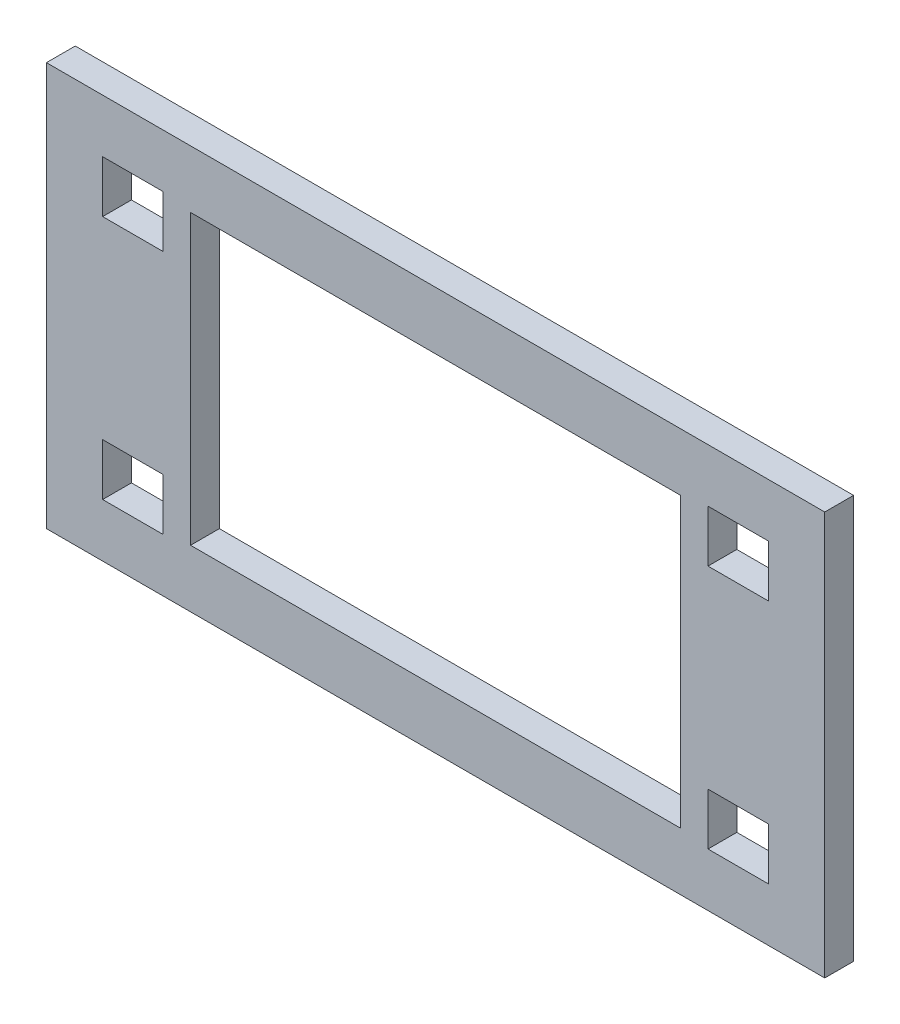
ISO-10303-21;
HEADER;
FILE_DESCRIPTION(('STEP AP214'),'2;1');
FILE_NAME('part.step','',(''),(''),'','','');
FILE_SCHEMA(('AUTOMOTIVE_DESIGN { 1 0 10303 214 1 1 1 1 }'));
ENDSEC;
DATA;
#1=APPLICATION_CONTEXT('core data for automotive mechanical design processes');
#2=APPLICATION_PROTOCOL_DEFINITION('international standard','automotive_design',2000,#1);
#3=PRODUCT_CONTEXT('',#1,'mechanical');
#4=PRODUCT('Part','Part','',(#3));
#5=PRODUCT_RELATED_PRODUCT_CATEGORY('part','',(#4));
#6=PRODUCT_DEFINITION_FORMATION('','',#4);
#7=PRODUCT_DEFINITION_CONTEXT('part definition',#1,'design');
#8=PRODUCT_DEFINITION('design','',#6,#7);
#9=PRODUCT_DEFINITION_SHAPE('','',#8);
#10=(LENGTH_UNIT() NAMED_UNIT(*) SI_UNIT(.MILLI.,.METRE.));
#11=(NAMED_UNIT(*) PLANE_ANGLE_UNIT() SI_UNIT($,.RADIAN.));
#12=(NAMED_UNIT(*) SI_UNIT($,.STERADIAN.) SOLID_ANGLE_UNIT());
#13=UNCERTAINTY_MEASURE_WITH_UNIT(LENGTH_MEASURE(1.E-05),#10,'distance_accuracy_value','');
#14=(GEOMETRIC_REPRESENTATION_CONTEXT(3) GLOBAL_UNCERTAINTY_ASSIGNED_CONTEXT((#13)) GLOBAL_UNIT_ASSIGNED_CONTEXT((#10,
#11,#12)) REPRESENTATION_CONTEXT('',''));
#15=CARTESIAN_POINT('',(0.,0.,0.));
#16=DIRECTION('',(0.,0.,1.));
#17=DIRECTION('',(1.,0.,0.));
#18=AXIS2_PLACEMENT_3D('',#15,#16,#17);
#19=CARTESIAN_POINT('',(0.,0.,2.));
#20=DIRECTION('',(0.,0.,1.));
#21=DIRECTION('',(1.,0.,0.));
#22=AXIS2_PLACEMENT_3D('',#19,#20,#21);
#23=PLANE('',#22);
#24=DIRECTION('',(0.,-1.,0.));
#25=VECTOR('',#24,1.);
#26=CARTESIAN_POINT('',(-27.,14.,2.));
#27=LINE('',#26,#25);
#28=CARTESIAN_POINT('',(-27.,14.,2.));
#29=VERTEX_POINT('',#28);
#30=CARTESIAN_POINT('',(-27.,-14.,2.));
#31=VERTEX_POINT('',#30);
#32=EDGE_CURVE('E286',#29,#31,#27,.T.);
#33=ORIENTED_EDGE('',*,*,#32,.T.);
#34=DIRECTION('',(1.,0.,0.));
#35=VECTOR('',#34,1.);
#36=CARTESIAN_POINT('',(-27.,-14.,2.));
#37=LINE('',#36,#35);
#38=CARTESIAN_POINT('',(27.,-14.,2.));
#39=VERTEX_POINT('',#38);
#40=EDGE_CURVE('E291',#31,#39,#37,.T.);
#41=ORIENTED_EDGE('',*,*,#40,.T.);
#42=DIRECTION('',(0.,1.,0.));
#43=VECTOR('',#42,1.);
#44=CARTESIAN_POINT('',(27.,-14.,2.));
#45=LINE('',#44,#43);
#46=CARTESIAN_POINT('',(27.,14.,2.));
#47=VERTEX_POINT('',#46);
#48=EDGE_CURVE('E298',#39,#47,#45,.T.);
#49=ORIENTED_EDGE('',*,*,#48,.T.);
#50=DIRECTION('',(-1.,0.,0.));
#51=VECTOR('',#50,1.);
#52=CARTESIAN_POINT('',(27.,14.,2.));
#53=LINE('',#52,#51);
#54=EDGE_CURVE('E297',#47,#29,#53,.T.);
#55=ORIENTED_EDGE('',*,*,#54,.T.);
#56=EDGE_LOOP('',(#33,#41,#49,#55));
#57=FACE_BOUND('',#56,.T.);
#58=DIRECTION('',(-1.,0.,0.));
#59=VECTOR('',#58,1.);
#60=CARTESIAN_POINT('',(0.,-10.,2.));
#61=LINE('',#60,#59);
#62=CARTESIAN_POINT('',(17.,-10.,2.));
#63=VERTEX_POINT('',#62);
#64=CARTESIAN_POINT('',(-17.,-10.,2.));
#65=VERTEX_POINT('',#64);
#66=EDGE_CURVE('E282',#63,#65,#61,.T.);
#67=ORIENTED_EDGE('',*,*,#66,.T.);
#68=DIRECTION('',(0.,1.,0.));
#69=VECTOR('',#68,1.);
#70=CARTESIAN_POINT('',(-17.,0.,2.));
#71=LINE('',#70,#69);
#72=CARTESIAN_POINT('',(-17.,10.,2.));
#73=VERTEX_POINT('',#72);
#74=EDGE_CURVE('E288',#65,#73,#71,.T.);
#75=ORIENTED_EDGE('',*,*,#74,.T.);
#76=DIRECTION('',(1.,0.,0.));
#77=VECTOR('',#76,1.);
#78=CARTESIAN_POINT('',(0.,10.,2.));
#79=LINE('',#78,#77);
#80=CARTESIAN_POINT('',(17.,10.,2.));
#81=VERTEX_POINT('',#80);
#82=EDGE_CURVE('E280',#73,#81,#79,.T.);
#83=ORIENTED_EDGE('',*,*,#82,.T.);
#84=DIRECTION('',(0.,-1.,0.));
#85=VECTOR('',#84,1.);
#86=CARTESIAN_POINT('',(17.,0.,2.));
#87=LINE('',#86,#85);
#88=EDGE_CURVE('E278',#81,#63,#87,.T.);
#89=ORIENTED_EDGE('',*,*,#88,.T.);
#90=EDGE_LOOP('',(#67,#75,#83,#89));
#91=FACE_BOUND('',#90,.T.);
#92=DIRECTION('',(-1.,0.,0.));
#93=VECTOR('',#92,1.);
#94=CARTESIAN_POINT('',(0.,-10.3,2.));
#95=LINE('',#94,#93);
#96=CARTESIAN_POINT('',(-18.9,-10.3,2.));
#97=VERTEX_POINT('',#96);
#98=CARTESIAN_POINT('',(-23.1,-10.3,2.));
#99=VERTEX_POINT('',#98);
#100=EDGE_CURVE('E223',#97,#99,#95,.T.);
#101=ORIENTED_EDGE('',*,*,#100,.T.);
#102=DIRECTION('',(0.,1.,0.));
#103=VECTOR('',#102,1.);
#104=CARTESIAN_POINT('',(-23.1,0.,2.));
#105=LINE('',#104,#103);
#106=CARTESIAN_POINT('',(-23.1,-6.7,2.));
#107=VERTEX_POINT('',#106);
#108=EDGE_CURVE('E216',#99,#107,#105,.T.);
#109=ORIENTED_EDGE('',*,*,#108,.T.);
#110=DIRECTION('',(1.,0.,0.));
#111=VECTOR('',#110,1.);
#112=CARTESIAN_POINT('',(0.,-6.7,2.));
#113=LINE('',#112,#111);
#114=CARTESIAN_POINT('',(-18.9,-6.7,2.));
#115=VERTEX_POINT('',#114);
#116=EDGE_CURVE('E200',#107,#115,#113,.T.);
#117=ORIENTED_EDGE('',*,*,#116,.T.);
#118=DIRECTION('',(0.,-1.,0.));
#119=VECTOR('',#118,1.);
#120=CARTESIAN_POINT('',(-18.9,0.,2.));
#121=LINE('',#120,#119);
#122=EDGE_CURVE('E209',#115,#97,#121,.T.);
#123=ORIENTED_EDGE('',*,*,#122,.T.);
#124=EDGE_LOOP('',(#101,#109,#117,#123));
#125=FACE_BOUND('',#124,.T.);
#126=DIRECTION('',(-1.,0.,0.));
#127=VECTOR('',#126,1.);
#128=CARTESIAN_POINT('',(0.,6.7,2.));
#129=LINE('',#128,#127);
#130=CARTESIAN_POINT('',(23.1,6.7,2.));
#131=VERTEX_POINT('',#130);
#132=CARTESIAN_POINT('',(18.9,6.7,2.));
#133=VERTEX_POINT('',#132);
#134=EDGE_CURVE('E237',#131,#133,#129,.T.);
#135=ORIENTED_EDGE('',*,*,#134,.T.);
#136=DIRECTION('',(0.,1.,0.));
#137=VECTOR('',#136,1.);
#138=CARTESIAN_POINT('',(18.9,0.,2.));
#139=LINE('',#138,#137);
#140=CARTESIAN_POINT('',(18.9,10.3,2.));
#141=VERTEX_POINT('',#140);
#142=EDGE_CURVE('E239',#133,#141,#139,.T.);
#143=ORIENTED_EDGE('',*,*,#142,.T.);
#144=DIRECTION('',(1.,0.,0.));
#145=VECTOR('',#144,1.);
#146=CARTESIAN_POINT('',(0.,10.3,2.));
#147=LINE('',#146,#145);
#148=CARTESIAN_POINT('',(23.1,10.3,2.));
#149=VERTEX_POINT('',#148);
#150=EDGE_CURVE('E228',#141,#149,#147,.T.);
#151=ORIENTED_EDGE('',*,*,#150,.T.);
#152=DIRECTION('',(0.,-1.,0.));
#153=VECTOR('',#152,1.);
#154=CARTESIAN_POINT('',(23.1,0.,2.));
#155=LINE('',#154,#153);
#156=EDGE_CURVE('E230',#149,#131,#155,.T.);
#157=ORIENTED_EDGE('',*,*,#156,.T.);
#158=EDGE_LOOP('',(#135,#143,#151,#157));
#159=FACE_BOUND('',#158,.T.);
#160=DIRECTION('',(-1.,0.,0.));
#161=VECTOR('',#160,1.);
#162=CARTESIAN_POINT('',(0.,-10.3,2.));
#163=LINE('',#162,#161);
#164=CARTESIAN_POINT('',(23.1,-10.3,2.));
#165=VERTEX_POINT('',#164);
#166=CARTESIAN_POINT('',(18.9,-10.3,2.));
#167=VERTEX_POINT('',#166);
#168=EDGE_CURVE('E247',#165,#167,#163,.T.);
#169=ORIENTED_EDGE('',*,*,#168,.T.);
#170=DIRECTION('',(0.,1.,0.));
#171=VECTOR('',#170,1.);
#172=CARTESIAN_POINT('',(18.9,0.,2.));
#173=LINE('',#172,#171);
#174=CARTESIAN_POINT('',(18.9,-6.7,2.));
#175=VERTEX_POINT('',#174);
#176=EDGE_CURVE('E253',#167,#175,#173,.T.);
#177=ORIENTED_EDGE('',*,*,#176,.T.);
#178=DIRECTION('',(1.,0.,0.));
#179=VECTOR('',#178,1.);
#180=CARTESIAN_POINT('',(0.,-6.7,2.));
#181=LINE('',#180,#179);
#182=CARTESIAN_POINT('',(23.1,-6.7,2.));
#183=VERTEX_POINT('',#182);
#184=EDGE_CURVE('E244',#175,#183,#181,.T.);
#185=ORIENTED_EDGE('',*,*,#184,.T.);
#186=DIRECTION('',(0.,-1.,0.));
#187=VECTOR('',#186,1.);
#188=CARTESIAN_POINT('',(23.1,0.,2.));
#189=LINE('',#188,#187);
#190=EDGE_CURVE('E241',#183,#165,#189,.T.);
#191=ORIENTED_EDGE('',*,*,#190,.T.);
#192=EDGE_LOOP('',(#169,#177,#185,#191));
#193=FACE_BOUND('',#192,.T.);
#194=DIRECTION('',(-1.,0.,0.));
#195=VECTOR('',#194,1.);
#196=CARTESIAN_POINT('',(0.,6.7,2.));
#197=LINE('',#196,#195);
#198=CARTESIAN_POINT('',(-18.9,6.7,2.));
#199=VERTEX_POINT('',#198);
#200=CARTESIAN_POINT('',(-23.1,6.7,2.));
#201=VERTEX_POINT('',#200);
#202=EDGE_CURVE('E257',#199,#201,#197,.T.);
#203=ORIENTED_EDGE('',*,*,#202,.T.);
#204=DIRECTION('',(0.,1.,0.));
#205=VECTOR('',#204,1.);
#206=CARTESIAN_POINT('',(-23.1,0.,2.));
#207=LINE('',#206,#205);
#208=CARTESIAN_POINT('',(-23.1,10.3,2.));
#209=VERTEX_POINT('',#208);
#210=EDGE_CURVE('E263',#201,#209,#207,.T.);
#211=ORIENTED_EDGE('',*,*,#210,.T.);
#212=DIRECTION('',(1.,0.,0.));
#213=VECTOR('',#212,1.);
#214=CARTESIAN_POINT('',(0.,10.3,2.));
#215=LINE('',#214,#213);
#216=CARTESIAN_POINT('',(-18.9,10.3,2.));
#217=VERTEX_POINT('',#216);
#218=EDGE_CURVE('E255',#209,#217,#215,.T.);
#219=ORIENTED_EDGE('',*,*,#218,.T.);
#220=DIRECTION('',(0.,-1.,0.));
#221=VECTOR('',#220,1.);
#222=CARTESIAN_POINT('',(-18.9,0.,2.));
#223=LINE('',#222,#221);
#224=EDGE_CURVE('E260',#217,#199,#223,.T.);
#225=ORIENTED_EDGE('',*,*,#224,.T.);
#226=EDGE_LOOP('',(#203,#211,#219,#225));
#227=FACE_BOUND('',#226,.T.);
#228=ADVANCED_FACE('F39',(#57,#91,#125,#159,#193,#227),#23,.T.);
#229=CARTESIAN_POINT('',(0.,0.,0.));
#230=DIRECTION('',(0.,0.,1.));
#231=DIRECTION('',(1.,0.,0.));
#232=AXIS2_PLACEMENT_3D('',#229,#230,#231);
#233=PLANE('',#232);
#234=DIRECTION('',(0.,1.,0.));
#235=VECTOR('',#234,1.);
#236=CARTESIAN_POINT('',(18.9,0.,0.));
#237=LINE('',#236,#235);
#238=CARTESIAN_POINT('',(18.9,-10.3,0.));
#239=VERTEX_POINT('',#238);
#240=CARTESIAN_POINT('',(18.9,-6.7,0.));
#241=VERTEX_POINT('',#240);
#242=EDGE_CURVE('E348',#239,#241,#237,.T.);
#243=ORIENTED_EDGE('',*,*,#242,.F.);
#244=DIRECTION('',(-1.,0.,0.));
#245=VECTOR('',#244,1.);
#246=CARTESIAN_POINT('',(0.,-10.3,0.));
#247=LINE('',#246,#245);
#248=CARTESIAN_POINT('',(23.1,-10.3,0.));
#249=VERTEX_POINT('',#248);
#250=EDGE_CURVE('E346',#249,#239,#247,.T.);
#251=ORIENTED_EDGE('',*,*,#250,.F.);
#252=DIRECTION('',(0.,-1.,0.));
#253=VECTOR('',#252,1.);
#254=CARTESIAN_POINT('',(23.1,0.,0.));
#255=LINE('',#254,#253);
#256=CARTESIAN_POINT('',(23.1,-6.7,0.));
#257=VERTEX_POINT('',#256);
#258=EDGE_CURVE('E347',#257,#249,#255,.T.);
#259=ORIENTED_EDGE('',*,*,#258,.F.);
#260=DIRECTION('',(1.,0.,0.));
#261=VECTOR('',#260,1.);
#262=CARTESIAN_POINT('',(0.,-6.7,0.));
#263=LINE('',#262,#261);
#264=EDGE_CURVE('E345',#241,#257,#263,.T.);
#265=ORIENTED_EDGE('',*,*,#264,.F.);
#266=EDGE_LOOP('',(#243,#251,#259,#265));
#267=FACE_BOUND('',#266,.T.);
#268=DIRECTION('',(0.,1.,0.));
#269=VECTOR('',#268,1.);
#270=CARTESIAN_POINT('',(-23.1,0.,0.));
#271=LINE('',#270,#269);
#272=CARTESIAN_POINT('',(-23.1,-10.3,0.));
#273=VERTEX_POINT('',#272);
#274=CARTESIAN_POINT('',(-23.1,-6.7,0.));
#275=VERTEX_POINT('',#274);
#276=EDGE_CURVE('E218',#273,#275,#271,.T.);
#277=ORIENTED_EDGE('',*,*,#276,.F.);
#278=DIRECTION('',(-1.,0.,0.));
#279=VECTOR('',#278,1.);
#280=CARTESIAN_POINT('',(0.,-10.3,0.));
#281=LINE('',#280,#279);
#282=CARTESIAN_POINT('',(-18.9,-10.3,0.));
#283=VERTEX_POINT('',#282);
#284=EDGE_CURVE('E335',#283,#273,#281,.T.);
#285=ORIENTED_EDGE('',*,*,#284,.F.);
#286=DIRECTION('',(0.,-1.,0.));
#287=VECTOR('',#286,1.);
#288=CARTESIAN_POINT('',(-18.9,0.,0.));
#289=LINE('',#288,#287);
#290=CARTESIAN_POINT('',(-18.9,-6.7,0.));
#291=VERTEX_POINT('',#290);
#292=EDGE_CURVE('E329',#291,#283,#289,.T.);
#293=ORIENTED_EDGE('',*,*,#292,.F.);
#294=DIRECTION('',(1.,0.,0.));
#295=VECTOR('',#294,1.);
#296=CARTESIAN_POINT('',(0.,-6.7,0.));
#297=LINE('',#296,#295);
#298=EDGE_CURVE('E327',#275,#291,#297,.T.);
#299=ORIENTED_EDGE('',*,*,#298,.F.);
#300=EDGE_LOOP('',(#277,#285,#293,#299));
#301=FACE_BOUND('',#300,.T.);
#302=DIRECTION('',(0.,-1.,0.));
#303=VECTOR('',#302,1.);
#304=CARTESIAN_POINT('',(-27.,14.,0.));
#305=LINE('',#304,#303);
#306=CARTESIAN_POINT('',(-27.,14.,0.));
#307=VERTEX_POINT('',#306);
#308=CARTESIAN_POINT('',(-27.,-14.,0.));
#309=VERTEX_POINT('',#308);
#310=EDGE_CURVE('E290',#307,#309,#305,.T.);
#311=ORIENTED_EDGE('',*,*,#310,.F.);
#312=DIRECTION('',(-1.,0.,0.));
#313=VECTOR('',#312,1.);
#314=CARTESIAN_POINT('',(27.,14.,0.));
#315=LINE('',#314,#313);
#316=CARTESIAN_POINT('',(27.,14.,0.));
#317=VERTEX_POINT('',#316);
#318=EDGE_CURVE('E294',#317,#307,#315,.T.);
#319=ORIENTED_EDGE('',*,*,#318,.F.);
#320=DIRECTION('',(0.,1.,0.));
#321=VECTOR('',#320,1.);
#322=CARTESIAN_POINT('',(27.,-14.,0.));
#323=LINE('',#322,#321);
#324=CARTESIAN_POINT('',(27.,-14.,0.));
#325=VERTEX_POINT('',#324);
#326=EDGE_CURVE('E301',#325,#317,#323,.T.);
#327=ORIENTED_EDGE('',*,*,#326,.F.);
#328=DIRECTION('',(1.,0.,0.));
#329=VECTOR('',#328,1.);
#330=CARTESIAN_POINT('',(-27.,-14.,0.));
#331=LINE('',#330,#329);
#332=EDGE_CURVE('E302',#309,#325,#331,.T.);
#333=ORIENTED_EDGE('',*,*,#332,.F.);
#334=EDGE_LOOP('',(#311,#319,#327,#333));
#335=FACE_BOUND('',#334,.T.);
#336=DIRECTION('',(0.,1.,0.));
#337=VECTOR('',#336,1.);
#338=CARTESIAN_POINT('',(-17.,0.,0.));
#339=LINE('',#338,#337);
#340=CARTESIAN_POINT('',(-17.,-10.,0.));
#341=VERTEX_POINT('',#340);
#342=CARTESIAN_POINT('',(-17.,10.,0.));
#343=VERTEX_POINT('',#342);
#344=EDGE_CURVE('E324',#341,#343,#339,.T.);
#345=ORIENTED_EDGE('',*,*,#344,.F.);
#346=DIRECTION('',(-1.,0.,0.));
#347=VECTOR('',#346,1.);
#348=CARTESIAN_POINT('',(0.,-10.,0.));
#349=LINE('',#348,#347);
#350=CARTESIAN_POINT('',(17.,-10.,0.));
#351=VERTEX_POINT('',#350);
#352=EDGE_CURVE('E323',#351,#341,#349,.T.);
#353=ORIENTED_EDGE('',*,*,#352,.F.);
#354=DIRECTION('',(0.,-1.,0.));
#355=VECTOR('',#354,1.);
#356=CARTESIAN_POINT('',(17.,0.,0.));
#357=LINE('',#356,#355);
#358=CARTESIAN_POINT('',(17.,10.,0.));
#359=VERTEX_POINT('',#358);
#360=EDGE_CURVE('E321',#359,#351,#357,.T.);
#361=ORIENTED_EDGE('',*,*,#360,.F.);
#362=DIRECTION('',(1.,0.,0.));
#363=VECTOR('',#362,1.);
#364=CARTESIAN_POINT('',(0.,10.,0.));
#365=LINE('',#364,#363);
#366=EDGE_CURVE('E317',#343,#359,#365,.T.);
#367=ORIENTED_EDGE('',*,*,#366,.F.);
#368=EDGE_LOOP('',(#345,#353,#361,#367));
#369=FACE_BOUND('',#368,.T.);
#370=DIRECTION('',(0.,1.,0.));
#371=VECTOR('',#370,1.);
#372=CARTESIAN_POINT('',(18.9,0.,0.));
#373=LINE('',#372,#371);
#374=CARTESIAN_POINT('',(18.9,6.7,0.));
#375=VERTEX_POINT('',#374);
#376=CARTESIAN_POINT('',(18.9,10.3,0.));
#377=VERTEX_POINT('',#376);
#378=EDGE_CURVE('E343',#375,#377,#373,.T.);
#379=ORIENTED_EDGE('',*,*,#378,.F.);
#380=DIRECTION('',(-1.,0.,0.));
#381=VECTOR('',#380,1.);
#382=CARTESIAN_POINT('',(0.,6.7,0.));
#383=LINE('',#382,#381);
#384=CARTESIAN_POINT('',(23.1,6.7,0.));
#385=VERTEX_POINT('',#384);
#386=EDGE_CURVE('E340',#385,#375,#383,.T.);
#387=ORIENTED_EDGE('',*,*,#386,.F.);
#388=DIRECTION('',(0.,-1.,0.));
#389=VECTOR('',#388,1.);
#390=CARTESIAN_POINT('',(23.1,0.,0.));
#391=LINE('',#390,#389);
#392=CARTESIAN_POINT('',(23.1,10.3,0.));
#393=VERTEX_POINT('',#392);
#394=EDGE_CURVE('E339',#393,#385,#391,.T.);
#395=ORIENTED_EDGE('',*,*,#394,.F.);
#396=DIRECTION('',(1.,0.,0.));
#397=VECTOR('',#396,1.);
#398=CARTESIAN_POINT('',(0.,10.3,0.));
#399=LINE('',#398,#397);
#400=EDGE_CURVE('E333',#377,#393,#399,.T.);
#401=ORIENTED_EDGE('',*,*,#400,.F.);
#402=EDGE_LOOP('',(#379,#387,#395,#401));
#403=FACE_BOUND('',#402,.T.);
#404=DIRECTION('',(0.,1.,0.));
#405=VECTOR('',#404,1.);
#406=CARTESIAN_POINT('',(-23.1,0.,0.));
#407=LINE('',#406,#405);
#408=CARTESIAN_POINT('',(-23.1,6.7,0.));
#409=VERTEX_POINT('',#408);
#410=CARTESIAN_POINT('',(-23.1,10.3,0.));
#411=VERTEX_POINT('',#410);
#412=EDGE_CURVE('E11',#409,#411,#407,.T.);
#413=ORIENTED_EDGE('',*,*,#412,.F.);
#414=DIRECTION('',(-1.,0.,0.));
#415=VECTOR('',#414,1.);
#416=CARTESIAN_POINT('',(0.,6.7,0.));
#417=LINE('',#416,#415);
#418=CARTESIAN_POINT('',(-18.9,6.7,0.));
#419=VERTEX_POINT('',#418);
#420=EDGE_CURVE('E50',#419,#409,#417,.T.);
#421=ORIENTED_EDGE('',*,*,#420,.F.);
#422=DIRECTION('',(0.,-1.,0.));
#423=VECTOR('',#422,1.);
#424=CARTESIAN_POINT('',(-18.9,0.,0.));
#425=LINE('',#424,#423);
#426=CARTESIAN_POINT('',(-18.9,10.3,0.));
#427=VERTEX_POINT('',#426);
#428=EDGE_CURVE('E351',#427,#419,#425,.T.);
#429=ORIENTED_EDGE('',*,*,#428,.F.);
#430=DIRECTION('',(1.,0.,0.));
#431=VECTOR('',#430,1.);
#432=CARTESIAN_POINT('',(0.,10.3,0.));
#433=LINE('',#432,#431);
#434=EDGE_CURVE('E352',#411,#427,#433,.T.);
#435=ORIENTED_EDGE('',*,*,#434,.F.);
#436=EDGE_LOOP('',(#413,#421,#429,#435));
#437=FACE_BOUND('',#436,.T.);
#438=ADVANCED_FACE('F372',(#267,#301,#335,#369,#403,#437),#233,.F.);
#439=CARTESIAN_POINT('',(-27.,14.,2.));
#440=DIRECTION('',(1.,0.,0.));
#441=DIRECTION('',(0.,0.,-1.));
#442=AXIS2_PLACEMENT_3D('',#439,#440,#441);
#443=PLANE('',#442);
#444=ORIENTED_EDGE('',*,*,#310,.T.);
#445=DIRECTION('',(0.,0.,-1.));
#446=VECTOR('',#445,1.);
#447=CARTESIAN_POINT('',(-27.,-14.,2.));
#448=LINE('',#447,#446);
#449=EDGE_CURVE('E316',#31,#309,#448,.T.);
#450=ORIENTED_EDGE('',*,*,#449,.F.);
#451=ORIENTED_EDGE('',*,*,#32,.F.);
#452=DIRECTION('',(0.,0.,-1.));
#453=VECTOR('',#452,1.);
#454=CARTESIAN_POINT('',(-27.,14.,2.));
#455=LINE('',#454,#453);
#456=EDGE_CURVE('E296',#29,#307,#455,.T.);
#457=ORIENTED_EDGE('',*,*,#456,.T.);
#458=EDGE_LOOP('',(#444,#450,#451,#457));
#459=FACE_BOUND('',#458,.T.);
#460=ADVANCED_FACE('F41',(#459),#443,.F.);
#461=CARTESIAN_POINT('',(-27.,-14.,2.));
#462=DIRECTION('',(0.,1.,0.));
#463=DIRECTION('',(0.,0.,1.));
#464=AXIS2_PLACEMENT_3D('',#461,#462,#463);
#465=PLANE('',#464);
#466=ORIENTED_EDGE('',*,*,#332,.T.);
#467=DIRECTION('',(0.,0.,-1.));
#468=VECTOR('',#467,1.);
#469=CARTESIAN_POINT('',(27.,-14.,2.));
#470=LINE('',#469,#468);
#471=EDGE_CURVE('E311',#39,#325,#470,.T.);
#472=ORIENTED_EDGE('',*,*,#471,.F.);
#473=ORIENTED_EDGE('',*,*,#40,.F.);
#474=ORIENTED_EDGE('',*,*,#449,.T.);
#475=EDGE_LOOP('',(#466,#472,#473,#474));
#476=FACE_BOUND('',#475,.T.);
#477=ADVANCED_FACE('F469',(#476),#465,.F.);
#478=CARTESIAN_POINT('',(27.,-14.,2.));
#479=DIRECTION('',(-1.,0.,0.));
#480=DIRECTION('',(0.,0.,1.));
#481=AXIS2_PLACEMENT_3D('',#478,#479,#480);
#482=PLANE('',#481);
#483=ORIENTED_EDGE('',*,*,#326,.T.);
#484=DIRECTION('',(0.,0.,-1.));
#485=VECTOR('',#484,1.);
#486=CARTESIAN_POINT('',(27.,14.,2.));
#487=LINE('',#486,#485);
#488=EDGE_CURVE('E309',#47,#317,#487,.T.);
#489=ORIENTED_EDGE('',*,*,#488,.F.);
#490=ORIENTED_EDGE('',*,*,#48,.F.);
#491=ORIENTED_EDGE('',*,*,#471,.T.);
#492=EDGE_LOOP('',(#483,#489,#490,#491));
#493=FACE_BOUND('',#492,.T.);
#494=ADVANCED_FACE('F465',(#493),#482,.F.);
#495=CARTESIAN_POINT('',(27.,14.,2.));
#496=DIRECTION('',(0.,-1.,0.));
#497=DIRECTION('',(0.,0.,-1.));
#498=AXIS2_PLACEMENT_3D('',#495,#496,#497);
#499=PLANE('',#498);
#500=ORIENTED_EDGE('',*,*,#318,.T.);
#501=ORIENTED_EDGE('',*,*,#456,.F.);
#502=ORIENTED_EDGE('',*,*,#54,.F.);
#503=ORIENTED_EDGE('',*,*,#488,.T.);
#504=EDGE_LOOP('',(#500,#501,#502,#503));
#505=FACE_BOUND('',#504,.T.);
#506=ADVANCED_FACE('F463',(#505),#499,.F.);
#507=CARTESIAN_POINT('',(-17.,10.,2.1));
#508=DIRECTION('',(1.,0.,0.));
#509=DIRECTION('',(0.,0.,-1.));
#510=AXIS2_PLACEMENT_3D('',#507,#508,#509);
#511=PLANE('',#510);
#512=DIRECTION('',(0.,0.,-1.));
#513=VECTOR('',#512,1.);
#514=CARTESIAN_POINT('',(-17.,-10.,2.1));
#515=LINE('',#514,#513);
#516=EDGE_CURVE('E273',#65,#341,#515,.T.);
#517=ORIENTED_EDGE('',*,*,#516,.T.);
#518=ORIENTED_EDGE('',*,*,#344,.T.);
#519=DIRECTION('',(0.,0.,-1.));
#520=VECTOR('',#519,1.);
#521=CARTESIAN_POINT('',(-17.,10.,2.1));
#522=LINE('',#521,#520);
#523=EDGE_CURVE('E266',#73,#343,#522,.T.);
#524=ORIENTED_EDGE('',*,*,#523,.F.);
#525=ORIENTED_EDGE('',*,*,#74,.F.);
#526=EDGE_LOOP('',(#517,#518,#524,#525));
#527=FACE_BOUND('',#526,.T.);
#528=ADVANCED_FACE('F456',(#527),#511,.T.);
#529=CARTESIAN_POINT('',(-17.,-10.,2.1));
#530=DIRECTION('',(0.,1.,0.));
#531=DIRECTION('',(0.,0.,1.));
#532=AXIS2_PLACEMENT_3D('',#529,#530,#531);
#533=PLANE('',#532);
#534=DIRECTION('',(0.,0.,-1.));
#535=VECTOR('',#534,1.);
#536=CARTESIAN_POINT('',(17.,-10.,2.1));
#537=LINE('',#536,#535);
#538=EDGE_CURVE('E271',#63,#351,#537,.T.);
#539=ORIENTED_EDGE('',*,*,#538,.T.);
#540=ORIENTED_EDGE('',*,*,#352,.T.);
#541=ORIENTED_EDGE('',*,*,#516,.F.);
#542=ORIENTED_EDGE('',*,*,#66,.F.);
#543=EDGE_LOOP('',(#539,#540,#541,#542));
#544=FACE_BOUND('',#543,.T.);
#545=ADVANCED_FACE('F512',(#544),#533,.T.);
#546=CARTESIAN_POINT('',(17.,-10.,2.1));
#547=DIRECTION('',(-1.,0.,0.));
#548=DIRECTION('',(0.,0.,1.));
#549=AXIS2_PLACEMENT_3D('',#546,#547,#548);
#550=PLANE('',#549);
#551=DIRECTION('',(0.,0.,-1.));
#552=VECTOR('',#551,1.);
#553=CARTESIAN_POINT('',(17.,10.,2.1));
#554=LINE('',#553,#552);
#555=EDGE_CURVE('E268',#81,#359,#554,.T.);
#556=ORIENTED_EDGE('',*,*,#555,.T.);
#557=ORIENTED_EDGE('',*,*,#360,.T.);
#558=ORIENTED_EDGE('',*,*,#538,.F.);
#559=ORIENTED_EDGE('',*,*,#88,.F.);
#560=EDGE_LOOP('',(#556,#557,#558,#559));
#561=FACE_BOUND('',#560,.T.);
#562=ADVANCED_FACE('F516',(#561),#550,.T.);
#563=CARTESIAN_POINT('',(17.,10.,2.1));
#564=DIRECTION('',(0.,-1.,0.));
#565=DIRECTION('',(0.,0.,-1.));
#566=AXIS2_PLACEMENT_3D('',#563,#564,#565);
#567=PLANE('',#566);
#568=ORIENTED_EDGE('',*,*,#523,.T.);
#569=ORIENTED_EDGE('',*,*,#366,.T.);
#570=ORIENTED_EDGE('',*,*,#555,.F.);
#571=ORIENTED_EDGE('',*,*,#82,.F.);
#572=EDGE_LOOP('',(#568,#569,#570,#571));
#573=FACE_BOUND('',#572,.T.);
#574=ADVANCED_FACE('F530',(#573),#567,.T.);
#575=CARTESIAN_POINT('',(-23.1,-6.7,2.1));
#576=DIRECTION('',(1.,0.,0.));
#577=DIRECTION('',(0.,0.,-1.));
#578=AXIS2_PLACEMENT_3D('',#575,#576,#577);
#579=PLANE('',#578);
#580=DIRECTION('',(0.,0.,-1.));
#581=VECTOR('',#580,1.);
#582=CARTESIAN_POINT('',(-23.1,-10.3,2.1));
#583=LINE('',#582,#581);
#584=EDGE_CURVE('E211',#99,#273,#583,.T.);
#585=ORIENTED_EDGE('',*,*,#584,.T.);
#586=ORIENTED_EDGE('',*,*,#276,.T.);
#587=DIRECTION('',(0.,0.,-1.));
#588=VECTOR('',#587,1.);
#589=CARTESIAN_POINT('',(-23.1,-6.7,2.1));
#590=LINE('',#589,#588);
#591=EDGE_CURVE('E205',#107,#275,#590,.T.);
#592=ORIENTED_EDGE('',*,*,#591,.F.);
#593=ORIENTED_EDGE('',*,*,#108,.F.);
#594=EDGE_LOOP('',(#585,#586,#592,#593));
#595=FACE_BOUND('',#594,.T.);
#596=ADVANCED_FACE('F214',(#595),#579,.T.);
#597=CARTESIAN_POINT('',(-23.1,-10.3,2.1));
#598=DIRECTION('',(0.,1.,0.));
#599=DIRECTION('',(0.,0.,1.));
#600=AXIS2_PLACEMENT_3D('',#597,#598,#599);
#601=PLANE('',#600);
#602=DIRECTION('',(0.,0.,-1.));
#603=VECTOR('',#602,1.);
#604=CARTESIAN_POINT('',(-18.9,-10.3,2.1));
#605=LINE('',#604,#603);
#606=EDGE_CURVE('E394',#97,#283,#605,.T.);
#607=ORIENTED_EDGE('',*,*,#606,.T.);
#608=ORIENTED_EDGE('',*,*,#284,.T.);
#609=ORIENTED_EDGE('',*,*,#584,.F.);
#610=ORIENTED_EDGE('',*,*,#100,.F.);
#611=EDGE_LOOP('',(#607,#608,#609,#610));
#612=FACE_BOUND('',#611,.T.);
#613=ADVANCED_FACE('F402',(#612),#601,.T.);
#614=CARTESIAN_POINT('',(-18.9,-10.3,2.1));
#615=DIRECTION('',(-1.,0.,0.));
#616=DIRECTION('',(0.,0.,1.));
#617=AXIS2_PLACEMENT_3D('',#614,#615,#616);
#618=PLANE('',#617);
#619=DIRECTION('',(0.,0.,-1.));
#620=VECTOR('',#619,1.);
#621=CARTESIAN_POINT('',(-18.9,-6.7,2.1));
#622=LINE('',#621,#620);
#623=EDGE_CURVE('E202',#115,#291,#622,.T.);
#624=ORIENTED_EDGE('',*,*,#623,.T.);
#625=ORIENTED_EDGE('',*,*,#292,.T.);
#626=ORIENTED_EDGE('',*,*,#606,.F.);
#627=ORIENTED_EDGE('',*,*,#122,.F.);
#628=EDGE_LOOP('',(#624,#625,#626,#627));
#629=FACE_BOUND('',#628,.T.);
#630=ADVANCED_FACE('F399',(#629),#618,.T.);
#631=CARTESIAN_POINT('',(-18.9,-6.7,2.1));
#632=DIRECTION('',(0.,-1.,0.));
#633=DIRECTION('',(0.,0.,-1.));
#634=AXIS2_PLACEMENT_3D('',#631,#632,#633);
#635=PLANE('',#634);
#636=ORIENTED_EDGE('',*,*,#591,.T.);
#637=ORIENTED_EDGE('',*,*,#298,.T.);
#638=ORIENTED_EDGE('',*,*,#623,.F.);
#639=ORIENTED_EDGE('',*,*,#116,.F.);
#640=EDGE_LOOP('',(#636,#637,#638,#639));
#641=FACE_BOUND('',#640,.T.);
#642=ADVANCED_FACE('F203',(#641),#635,.T.);
#643=CARTESIAN_POINT('',(18.9,10.3,2.1));
#644=DIRECTION('',(1.,0.,0.));
#645=DIRECTION('',(0.,0.,-1.));
#646=AXIS2_PLACEMENT_3D('',#643,#644,#645);
#647=PLANE('',#646);
#648=DIRECTION('',(0.,0.,-1.));
#649=VECTOR('',#648,1.);
#650=CARTESIAN_POINT('',(18.9,6.7,2.1));
#651=LINE('',#650,#649);
#652=EDGE_CURVE('E421',#133,#375,#651,.T.);
#653=ORIENTED_EDGE('',*,*,#652,.T.);
#654=ORIENTED_EDGE('',*,*,#378,.T.);
#655=DIRECTION('',(0.,0.,-1.));
#656=VECTOR('',#655,1.);
#657=CARTESIAN_POINT('',(18.9,10.3,2.1));
#658=LINE('',#657,#656);
#659=EDGE_CURVE('E387',#141,#377,#658,.T.);
#660=ORIENTED_EDGE('',*,*,#659,.F.);
#661=ORIENTED_EDGE('',*,*,#142,.F.);
#662=EDGE_LOOP('',(#653,#654,#660,#661));
#663=FACE_BOUND('',#662,.T.);
#664=ADVANCED_FACE('F423',(#663),#647,.T.);
#665=CARTESIAN_POINT('',(18.9,6.7,2.1));
#666=DIRECTION('',(0.,1.,0.));
#667=DIRECTION('',(0.,0.,1.));
#668=AXIS2_PLACEMENT_3D('',#665,#666,#667);
#669=PLANE('',#668);
#670=DIRECTION('',(0.,0.,-1.));
#671=VECTOR('',#670,1.);
#672=CARTESIAN_POINT('',(23.1,6.7,2.1));
#673=LINE('',#672,#671);
#674=EDGE_CURVE('E422',#131,#385,#673,.T.);
#675=ORIENTED_EDGE('',*,*,#674,.T.);
#676=ORIENTED_EDGE('',*,*,#386,.T.);
#677=ORIENTED_EDGE('',*,*,#652,.F.);
#678=ORIENTED_EDGE('',*,*,#134,.F.);
#679=EDGE_LOOP('',(#675,#676,#677,#678));
#680=FACE_BOUND('',#679,.T.);
#681=ADVANCED_FACE('F437',(#680),#669,.T.);
#682=CARTESIAN_POINT('',(23.1,6.7,2.1));
#683=DIRECTION('',(-1.,0.,0.));
#684=DIRECTION('',(0.,0.,1.));
#685=AXIS2_PLACEMENT_3D('',#682,#683,#684);
#686=PLANE('',#685);
#687=DIRECTION('',(0.,0.,-1.));
#688=VECTOR('',#687,1.);
#689=CARTESIAN_POINT('',(23.1,10.3,2.1));
#690=LINE('',#689,#688);
#691=EDGE_CURVE('E428',#149,#393,#690,.T.);
#692=ORIENTED_EDGE('',*,*,#691,.T.);
#693=ORIENTED_EDGE('',*,*,#394,.T.);
#694=ORIENTED_EDGE('',*,*,#674,.F.);
#695=ORIENTED_EDGE('',*,*,#156,.F.);
#696=EDGE_LOOP('',(#692,#693,#694,#695));
#697=FACE_BOUND('',#696,.T.);
#698=ADVANCED_FACE('F439',(#697),#686,.T.);
#699=CARTESIAN_POINT('',(23.1,10.3,2.1));
#700=DIRECTION('',(0.,-1.,0.));
#701=DIRECTION('',(0.,0.,-1.));
#702=AXIS2_PLACEMENT_3D('',#699,#700,#701);
#703=PLANE('',#702);
#704=ORIENTED_EDGE('',*,*,#659,.T.);
#705=ORIENTED_EDGE('',*,*,#400,.T.);
#706=ORIENTED_EDGE('',*,*,#691,.F.);
#707=ORIENTED_EDGE('',*,*,#150,.F.);
#708=EDGE_LOOP('',(#704,#705,#706,#707));
#709=FACE_BOUND('',#708,.T.);
#710=ADVANCED_FACE('F432',(#709),#703,.T.);
#711=CARTESIAN_POINT('',(18.9,-6.7,2.1));
#712=DIRECTION('',(1.,0.,0.));
#713=DIRECTION('',(0.,0.,-1.));
#714=AXIS2_PLACEMENT_3D('',#711,#712,#713);
#715=PLANE('',#714);
#716=DIRECTION('',(0.,0.,-1.));
#717=VECTOR('',#716,1.);
#718=CARTESIAN_POINT('',(18.9,-10.3,2.1));
#719=LINE('',#718,#717);
#720=EDGE_CURVE('E385',#167,#239,#719,.T.);
#721=ORIENTED_EDGE('',*,*,#720,.T.);
#722=ORIENTED_EDGE('',*,*,#242,.T.);
#723=DIRECTION('',(0.,0.,-1.));
#724=VECTOR('',#723,1.);
#725=CARTESIAN_POINT('',(18.9,-6.7,2.1));
#726=LINE('',#725,#724);
#727=EDGE_CURVE('E375',#175,#241,#726,.T.);
#728=ORIENTED_EDGE('',*,*,#727,.F.);
#729=ORIENTED_EDGE('',*,*,#176,.F.);
#730=EDGE_LOOP('',(#721,#722,#728,#729));
#731=FACE_BOUND('',#730,.T.);
#732=ADVANCED_FACE('F449',(#731),#715,.T.);
#733=CARTESIAN_POINT('',(18.9,-10.3,2.1));
#734=DIRECTION('',(0.,1.,0.));
#735=DIRECTION('',(0.,0.,1.));
#736=AXIS2_PLACEMENT_3D('',#733,#734,#735);
#737=PLANE('',#736);
#738=DIRECTION('',(0.,0.,-1.));
#739=VECTOR('',#738,1.);
#740=CARTESIAN_POINT('',(23.1,-10.3,2.1));
#741=LINE('',#740,#739);
#742=EDGE_CURVE('E384',#165,#249,#741,.T.);
#743=ORIENTED_EDGE('',*,*,#742,.T.);
#744=ORIENTED_EDGE('',*,*,#250,.T.);
#745=ORIENTED_EDGE('',*,*,#720,.F.);
#746=ORIENTED_EDGE('',*,*,#168,.F.);
#747=EDGE_LOOP('',(#743,#744,#745,#746));
#748=FACE_BOUND('',#747,.T.);
#749=ADVANCED_FACE('F614',(#748),#737,.T.);
#750=CARTESIAN_POINT('',(23.1,-10.3,2.1));
#751=DIRECTION('',(-1.,0.,0.));
#752=DIRECTION('',(0.,0.,1.));
#753=AXIS2_PLACEMENT_3D('',#750,#751,#752);
#754=PLANE('',#753);
#755=DIRECTION('',(0.,0.,-1.));
#756=VECTOR('',#755,1.);
#757=CARTESIAN_POINT('',(23.1,-6.7,2.1));
#758=LINE('',#757,#756);
#759=EDGE_CURVE('E64',#183,#257,#758,.T.);
#760=ORIENTED_EDGE('',*,*,#759,.T.);
#761=ORIENTED_EDGE('',*,*,#258,.T.);
#762=ORIENTED_EDGE('',*,*,#742,.F.);
#763=ORIENTED_EDGE('',*,*,#190,.F.);
#764=EDGE_LOOP('',(#760,#761,#762,#763));
#765=FACE_BOUND('',#764,.T.);
#766=ADVANCED_FACE('F625',(#765),#754,.T.);
#767=CARTESIAN_POINT('',(23.1,-6.7,2.1));
#768=DIRECTION('',(0.,-1.,0.));
#769=DIRECTION('',(0.,0.,-1.));
#770=AXIS2_PLACEMENT_3D('',#767,#768,#769);
#771=PLANE('',#770);
#772=ORIENTED_EDGE('',*,*,#727,.T.);
#773=ORIENTED_EDGE('',*,*,#264,.T.);
#774=ORIENTED_EDGE('',*,*,#759,.F.);
#775=ORIENTED_EDGE('',*,*,#184,.F.);
#776=EDGE_LOOP('',(#772,#773,#774,#775));
#777=FACE_BOUND('',#776,.T.);
#778=ADVANCED_FACE('F634',(#777),#771,.T.);
#779=CARTESIAN_POINT('',(-23.1,10.3,2.1));
#780=DIRECTION('',(1.,0.,0.));
#781=DIRECTION('',(0.,0.,-1.));
#782=AXIS2_PLACEMENT_3D('',#779,#780,#781);
#783=PLANE('',#782);
#784=DIRECTION('',(0.,0.,-1.));
#785=VECTOR('',#784,1.);
#786=CARTESIAN_POINT('',(-23.1,6.7,2.1));
#787=LINE('',#786,#785);
#788=EDGE_CURVE('E362',#201,#409,#787,.T.);
#789=ORIENTED_EDGE('',*,*,#788,.T.);
#790=ORIENTED_EDGE('',*,*,#412,.T.);
#791=DIRECTION('',(0.,0.,-1.));
#792=VECTOR('',#791,1.);
#793=CARTESIAN_POINT('',(-23.1,10.3,2.1));
#794=LINE('',#793,#792);
#795=EDGE_CURVE('E222',#209,#411,#794,.T.);
#796=ORIENTED_EDGE('',*,*,#795,.F.);
#797=ORIENTED_EDGE('',*,*,#210,.F.);
#798=EDGE_LOOP('',(#789,#790,#796,#797));
#799=FACE_BOUND('',#798,.T.);
#800=ADVANCED_FACE('F369',(#799),#783,.T.);
#801=CARTESIAN_POINT('',(-23.1,6.7,2.1));
#802=DIRECTION('',(0.,1.,0.));
#803=DIRECTION('',(0.,0.,1.));
#804=AXIS2_PLACEMENT_3D('',#801,#802,#803);
#805=PLANE('',#804);
#806=DIRECTION('',(0.,0.,-1.));
#807=VECTOR('',#806,1.);
#808=CARTESIAN_POINT('',(-18.9,6.7,2.1));
#809=LINE('',#808,#807);
#810=EDGE_CURVE('E365',#199,#419,#809,.T.);
#811=ORIENTED_EDGE('',*,*,#810,.T.);
#812=ORIENTED_EDGE('',*,*,#420,.T.);
#813=ORIENTED_EDGE('',*,*,#788,.F.);
#814=ORIENTED_EDGE('',*,*,#202,.F.);
#815=EDGE_LOOP('',(#811,#812,#813,#814));
#816=FACE_BOUND('',#815,.T.);
#817=ADVANCED_FACE('F363',(#816),#805,.T.);
#818=CARTESIAN_POINT('',(-18.9,6.7,2.1));
#819=DIRECTION('',(-1.,0.,0.));
#820=DIRECTION('',(0.,0.,1.));
#821=AXIS2_PLACEMENT_3D('',#818,#819,#820);
#822=PLANE('',#821);
#823=DIRECTION('',(0.,0.,-1.));
#824=VECTOR('',#823,1.);
#825=CARTESIAN_POINT('',(-18.9,10.3,2.1));
#826=LINE('',#825,#824);
#827=EDGE_CURVE('E53',#217,#427,#826,.T.);
#828=ORIENTED_EDGE('',*,*,#827,.T.);
#829=ORIENTED_EDGE('',*,*,#428,.T.);
#830=ORIENTED_EDGE('',*,*,#810,.F.);
#831=ORIENTED_EDGE('',*,*,#224,.F.);
#832=EDGE_LOOP('',(#828,#829,#830,#831));
#833=FACE_BOUND('',#832,.T.);
#834=ADVANCED_FACE('F380',(#833),#822,.T.);
#835=CARTESIAN_POINT('',(-18.9,10.3,2.1));
#836=DIRECTION('',(0.,-1.,0.));
#837=DIRECTION('',(0.,0.,-1.));
#838=AXIS2_PLACEMENT_3D('',#835,#836,#837);
#839=PLANE('',#838);
#840=ORIENTED_EDGE('',*,*,#795,.T.);
#841=ORIENTED_EDGE('',*,*,#434,.T.);
#842=ORIENTED_EDGE('',*,*,#827,.F.);
#843=ORIENTED_EDGE('',*,*,#218,.F.);
#844=EDGE_LOOP('',(#840,#841,#842,#843));
#845=FACE_BOUND('',#844,.T.);
#846=ADVANCED_FACE('F374',(#845),#839,.T.);
#847=CLOSED_SHELL('',(#228,#438,#460,#477,#494,#506,#528,#545,#562,#574,#596,#613,#630,#642,
#664,#681,#698,#710,#732,#749,#766,#778,#800,#817,#834,#846));
#848=MANIFOLD_SOLID_BREP('B2',#847);
#849=ADVANCED_BREP_SHAPE_REPRESENTATION('',(#18,#848),#14);
#850=SHAPE_DEFINITION_REPRESENTATION(#9,#849);
ENDSEC;
END-ISO-10303-21;
